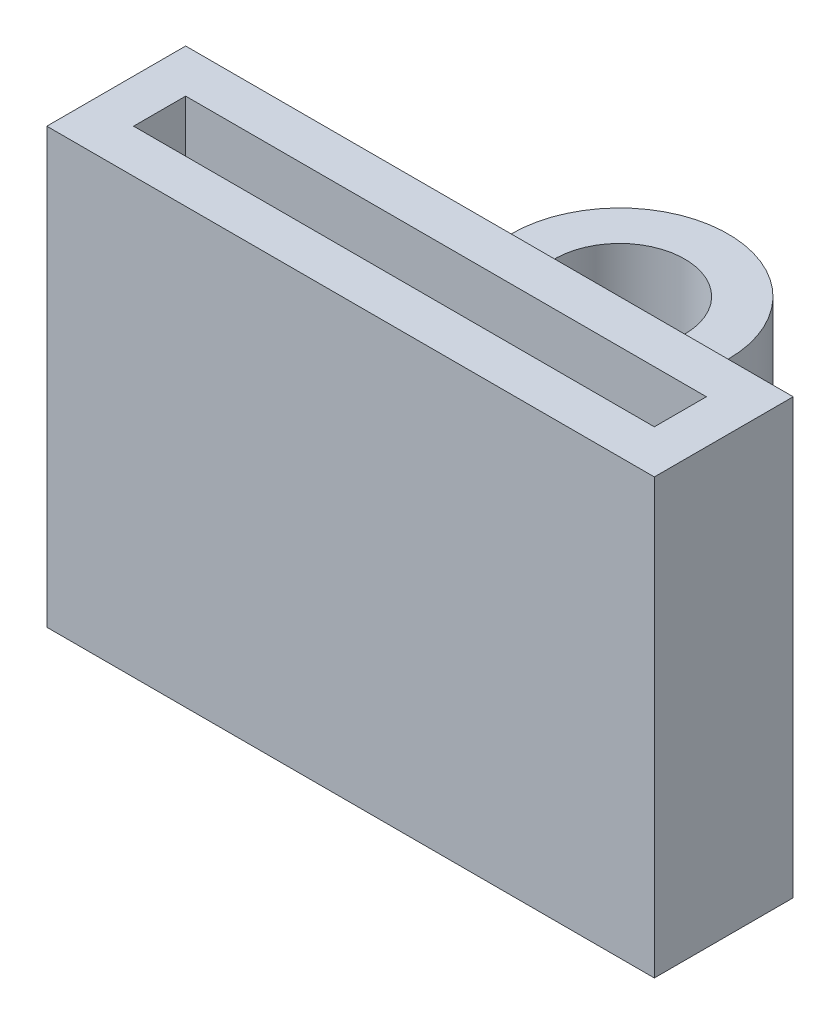
ISO-10303-21;
HEADER;
FILE_DESCRIPTION(('STEP AP214'),'2;1');
FILE_NAME('part.step','',(''),(''),'','','');
FILE_SCHEMA(('AUTOMOTIVE_DESIGN { 1 0 10303 214 1 1 1 1 }'));
ENDSEC;
DATA;
#1=APPLICATION_CONTEXT('core data for automotive mechanical design processes');
#2=APPLICATION_PROTOCOL_DEFINITION('international standard','automotive_design',2000,#1);
#3=PRODUCT_CONTEXT('',#1,'mechanical');
#4=PRODUCT('Part','Part','',(#3));
#5=PRODUCT_RELATED_PRODUCT_CATEGORY('part','',(#4));
#6=PRODUCT_DEFINITION_FORMATION('','',#4);
#7=PRODUCT_DEFINITION_CONTEXT('part definition',#1,'design');
#8=PRODUCT_DEFINITION('design','',#6,#7);
#9=PRODUCT_DEFINITION_SHAPE('','',#8);
#10=(LENGTH_UNIT() NAMED_UNIT(*) SI_UNIT(.MILLI.,.METRE.));
#11=(NAMED_UNIT(*) PLANE_ANGLE_UNIT() SI_UNIT($,.RADIAN.));
#12=(NAMED_UNIT(*) SI_UNIT($,.STERADIAN.) SOLID_ANGLE_UNIT());
#13=UNCERTAINTY_MEASURE_WITH_UNIT(LENGTH_MEASURE(1.E-05),#10,'distance_accuracy_value','');
#14=(GEOMETRIC_REPRESENTATION_CONTEXT(3) GLOBAL_UNCERTAINTY_ASSIGNED_CONTEXT((#13)) GLOBAL_UNIT_ASSIGNED_CONTEXT((#10,
#11,#12)) REPRESENTATION_CONTEXT('',''));
#15=CARTESIAN_POINT('',(0.,0.,0.));
#16=DIRECTION('',(0.,0.,1.));
#17=DIRECTION('',(1.,0.,0.));
#18=AXIS2_PLACEMENT_3D('',#15,#16,#17);
#19=CARTESIAN_POINT('',(0.,5.,-1.6));
#20=DIRECTION('',(0.,0.,-1.));
#21=DIRECTION('',(-1.,0.,0.));
#22=AXIS2_PLACEMENT_3D('',#19,#20,#21);
#23=PLANE('',#22);
#24=DIRECTION('',(1.,0.,0.));
#25=VECTOR('',#24,1.);
#26=CARTESIAN_POINT('',(0.,-5.,-1.6));
#27=LINE('',#26,#25);
#28=CARTESIAN_POINT('',(2.5,-5.,-1.6));
#29=VERTEX_POINT('',#28);
#30=CARTESIAN_POINT('',(6.99999999999999,-5.,-1.6));
#31=VERTEX_POINT('',#30);
#32=EDGE_CURVE('E55',#29,#31,#27,.T.);
#33=ORIENTED_EDGE('',*,*,#32,.F.);
#34=DIRECTION('',(0.,1.,0.));
#35=VECTOR('',#34,1.);
#36=CARTESIAN_POINT('',(2.5,-5.,-1.6));
#37=LINE('',#36,#35);
#38=CARTESIAN_POINT('',(2.5,2.,-1.6));
#39=VERTEX_POINT('',#38);
#40=EDGE_CURVE('E50',#29,#39,#37,.T.);
#41=ORIENTED_EDGE('',*,*,#40,.T.);
#42=DIRECTION('',(1.,0.,0.));
#43=VECTOR('',#42,1.);
#44=CARTESIAN_POINT('',(0.,2.,-1.6));
#45=LINE('',#44,#43);
#46=CARTESIAN_POINT('',(-2.5,2.,-1.6));
#47=VERTEX_POINT('',#46);
#48=EDGE_CURVE('E144',#47,#39,#45,.T.);
#49=ORIENTED_EDGE('',*,*,#48,.F.);
#50=DIRECTION('',(0.,1.,0.));
#51=VECTOR('',#50,1.);
#52=CARTESIAN_POINT('',(-2.5,-5.,-1.6));
#53=LINE('',#52,#51);
#54=CARTESIAN_POINT('',(-2.5,-5.,-1.6));
#55=VERTEX_POINT('',#54);
#56=EDGE_CURVE('E162',#55,#47,#53,.T.);
#57=ORIENTED_EDGE('',*,*,#56,.F.);
#58=CARTESIAN_POINT('',(-7.00000000000001,-5.,-1.6));
#59=VERTEX_POINT('',#58);
#60=EDGE_CURVE('E191',#59,#55,#27,.T.);
#61=ORIENTED_EDGE('',*,*,#60,.F.);
#62=DIRECTION('',(0.,-1.,0.));
#63=VECTOR('',#62,1.);
#64=CARTESIAN_POINT('',(-7.00000000000001,5.,-1.6));
#65=LINE('',#64,#63);
#66=CARTESIAN_POINT('',(-7.00000000000001,5.,-1.6));
#67=VERTEX_POINT('',#66);
#68=EDGE_CURVE('E218',#67,#59,#65,.T.);
#69=ORIENTED_EDGE('',*,*,#68,.F.);
#70=DIRECTION('',(1.,0.,0.));
#71=VECTOR('',#70,1.);
#72=CARTESIAN_POINT('',(0.,5.,-1.6));
#73=LINE('',#72,#71);
#74=CARTESIAN_POINT('',(6.99999999999999,5.,-1.6));
#75=VERTEX_POINT('',#74);
#76=EDGE_CURVE('E169',#67,#75,#73,.T.);
#77=ORIENTED_EDGE('',*,*,#76,.T.);
#78=DIRECTION('',(0.,-1.,0.));
#79=VECTOR('',#78,1.);
#80=CARTESIAN_POINT('',(6.99999999999999,5.,-1.6));
#81=LINE('',#80,#79);
#82=EDGE_CURVE('E37',#75,#31,#81,.T.);
#83=ORIENTED_EDGE('',*,*,#82,.T.);
#84=EDGE_LOOP('',(#33,#41,#49,#57,#61,#69,#77,#83));
#85=FACE_BOUND('',#84,.T.);
#86=ADVANCED_FACE('F33',(#85),#23,.T.);
#87=CARTESIAN_POINT('',(0.,5.,-0.600000000000001));
#88=DIRECTION('',(0.,0.,-1.));
#89=DIRECTION('',(-1.,0.,0.));
#90=AXIS2_PLACEMENT_3D('',#87,#88,#89);
#91=PLANE('',#90);
#92=DIRECTION('',(1.,0.,0.));
#93=VECTOR('',#92,1.);
#94=CARTESIAN_POINT('',(0.,-5.,-0.600000000000001));
#95=LINE('',#94,#93);
#96=CARTESIAN_POINT('',(-6.00000000000001,-5.,-0.600000000000001));
#97=VERTEX_POINT('',#96);
#98=CARTESIAN_POINT('',(5.99999999999999,-5.,-0.600000000000001));
#99=VERTEX_POINT('',#98);
#100=EDGE_CURVE('E199',#97,#99,#95,.T.);
#101=ORIENTED_EDGE('',*,*,#100,.T.);
#102=DIRECTION('',(0.,-1.,0.));
#103=VECTOR('',#102,1.);
#104=CARTESIAN_POINT('',(5.99999999999999,5.,-0.600000000000001));
#105=LINE('',#104,#103);
#106=CARTESIAN_POINT('',(5.99999999999999,5.,-0.600000000000001));
#107=VERTEX_POINT('',#106);
#108=EDGE_CURVE('E11',#107,#99,#105,.T.);
#109=ORIENTED_EDGE('',*,*,#108,.F.);
#110=DIRECTION('',(1.,0.,0.));
#111=VECTOR('',#110,1.);
#112=CARTESIAN_POINT('',(0.,5.,-0.600000000000001));
#113=LINE('',#112,#111);
#114=CARTESIAN_POINT('',(-6.00000000000001,5.,-0.600000000000001));
#115=VERTEX_POINT('',#114);
#116=EDGE_CURVE('E177',#115,#107,#113,.T.);
#117=ORIENTED_EDGE('',*,*,#116,.F.);
#118=DIRECTION('',(0.,-1.,0.));
#119=VECTOR('',#118,1.);
#120=CARTESIAN_POINT('',(-6.00000000000001,5.,-0.600000000000001));
#121=LINE('',#120,#119);
#122=EDGE_CURVE('E210',#115,#97,#121,.T.);
#123=ORIENTED_EDGE('',*,*,#122,.T.);
#124=EDGE_LOOP('',(#101,#109,#117,#123));
#125=FACE_BOUND('',#124,.T.);
#126=ADVANCED_FACE('F255',(#125),#91,.F.);
#127=CARTESIAN_POINT('',(5.99999999999999,5.,0.));
#128=DIRECTION('',(1.,0.,0.));
#129=DIRECTION('',(0.,0.,-1.));
#130=AXIS2_PLACEMENT_3D('',#127,#128,#129);
#131=PLANE('',#130);
#132=DIRECTION('',(0.,0.,1.));
#133=VECTOR('',#132,1.);
#134=CARTESIAN_POINT('',(5.99999999999999,-5.,0.));
#135=LINE('',#134,#133);
#136=CARTESIAN_POINT('',(5.99999999999999,-5.,0.599999999999999));
#137=VERTEX_POINT('',#136);
#138=EDGE_CURVE('E202',#99,#137,#135,.T.);
#139=ORIENTED_EDGE('',*,*,#138,.T.);
#140=DIRECTION('',(0.,-1.,0.));
#141=VECTOR('',#140,1.);
#142=CARTESIAN_POINT('',(5.99999999999999,5.,0.599999999999999));
#143=LINE('',#142,#141);
#144=CARTESIAN_POINT('',(5.99999999999999,5.,0.599999999999999));
#145=VERTEX_POINT('',#144);
#146=EDGE_CURVE('E42',#145,#137,#143,.T.);
#147=ORIENTED_EDGE('',*,*,#146,.F.);
#148=DIRECTION('',(0.,0.,1.));
#149=VECTOR('',#148,1.);
#150=CARTESIAN_POINT('',(5.99999999999999,5.,0.));
#151=LINE('',#150,#149);
#152=EDGE_CURVE('E180',#107,#145,#151,.T.);
#153=ORIENTED_EDGE('',*,*,#152,.F.);
#154=ORIENTED_EDGE('',*,*,#108,.T.);
#155=EDGE_LOOP('',(#139,#147,#153,#154));
#156=FACE_BOUND('',#155,.T.);
#157=ADVANCED_FACE('F259',(#156),#131,.F.);
#158=CARTESIAN_POINT('',(0.,5.,0.599999999999999));
#159=DIRECTION('',(0.,0.,-1.));
#160=DIRECTION('',(-1.,0.,0.));
#161=AXIS2_PLACEMENT_3D('',#158,#159,#160);
#162=PLANE('',#161);
#163=DIRECTION('',(1.,0.,0.));
#164=VECTOR('',#163,1.);
#165=CARTESIAN_POINT('',(0.,-5.,0.599999999999999));
#166=LINE('',#165,#164);
#167=CARTESIAN_POINT('',(-6.00000000000001,-5.,0.599999999999999));
#168=VERTEX_POINT('',#167);
#169=EDGE_CURVE('E205',#168,#137,#166,.T.);
#170=ORIENTED_EDGE('',*,*,#169,.F.);
#171=DIRECTION('',(0.,-1.,0.));
#172=VECTOR('',#171,1.);
#173=CARTESIAN_POINT('',(-6.00000000000001,5.,0.599999999999999));
#174=LINE('',#173,#172);
#175=CARTESIAN_POINT('',(-6.00000000000001,5.,0.599999999999999));
#176=VERTEX_POINT('',#175);
#177=EDGE_CURVE('E212',#176,#168,#174,.T.);
#178=ORIENTED_EDGE('',*,*,#177,.F.);
#179=DIRECTION('',(1.,0.,0.));
#180=VECTOR('',#179,1.);
#181=CARTESIAN_POINT('',(0.,5.,0.599999999999999));
#182=LINE('',#181,#180);
#183=EDGE_CURVE('E182',#176,#145,#182,.T.);
#184=ORIENTED_EDGE('',*,*,#183,.T.);
#185=ORIENTED_EDGE('',*,*,#146,.T.);
#186=EDGE_LOOP('',(#170,#178,#184,#185));
#187=FACE_BOUND('',#186,.T.);
#188=ADVANCED_FACE('F264',(#187),#162,.T.);
#189=CARTESIAN_POINT('',(6.99999999999999,5.,0.));
#190=DIRECTION('',(1.,0.,0.));
#191=DIRECTION('',(0.,0.,-1.));
#192=AXIS2_PLACEMENT_3D('',#189,#190,#191);
#193=PLANE('',#192);
#194=DIRECTION('',(0.,0.,1.));
#195=VECTOR('',#194,1.);
#196=CARTESIAN_POINT('',(6.99999999999999,-5.,0.));
#197=LINE('',#196,#195);
#198=CARTESIAN_POINT('',(6.99999999999999,-5.,1.6));
#199=VERTEX_POINT('',#198);
#200=EDGE_CURVE('E161',#31,#199,#197,.T.);
#201=ORIENTED_EDGE('',*,*,#200,.F.);
#202=ORIENTED_EDGE('',*,*,#82,.F.);
#203=DIRECTION('',(0.,0.,1.));
#204=VECTOR('',#203,1.);
#205=CARTESIAN_POINT('',(6.99999999999999,5.,0.));
#206=LINE('',#205,#204);
#207=CARTESIAN_POINT('',(6.99999999999999,5.,1.6));
#208=VERTEX_POINT('',#207);
#209=EDGE_CURVE('E166',#75,#208,#206,.T.);
#210=ORIENTED_EDGE('',*,*,#209,.T.);
#211=DIRECTION('',(0.,-1.,0.));
#212=VECTOR('',#211,1.);
#213=CARTESIAN_POINT('',(6.99999999999999,5.,1.6));
#214=LINE('',#213,#212);
#215=EDGE_CURVE('E188',#208,#199,#214,.T.);
#216=ORIENTED_EDGE('',*,*,#215,.T.);
#217=EDGE_LOOP('',(#201,#202,#210,#216));
#218=FACE_BOUND('',#217,.T.);
#219=ADVANCED_FACE('F35',(#218),#193,.T.);
#220=CARTESIAN_POINT('',(-7.00000000000001,5.,0.));
#221=DIRECTION('',(1.,0.,0.));
#222=DIRECTION('',(0.,0.,-1.));
#223=AXIS2_PLACEMENT_3D('',#220,#221,#222);
#224=PLANE('',#223);
#225=DIRECTION('',(0.,0.,1.));
#226=VECTOR('',#225,1.);
#227=CARTESIAN_POINT('',(-7.00000000000001,-5.,0.));
#228=LINE('',#227,#226);
#229=CARTESIAN_POINT('',(-7.00000000000001,-5.,1.6));
#230=VERTEX_POINT('',#229);
#231=EDGE_CURVE('E194',#59,#230,#228,.T.);
#232=ORIENTED_EDGE('',*,*,#231,.T.);
#233=DIRECTION('',(0.,-1.,0.));
#234=VECTOR('',#233,1.);
#235=CARTESIAN_POINT('',(-7.00000000000001,5.,1.6));
#236=LINE('',#235,#234);
#237=CARTESIAN_POINT('',(-7.00000000000001,5.,1.6));
#238=VERTEX_POINT('',#237);
#239=EDGE_CURVE('E216',#238,#230,#236,.T.);
#240=ORIENTED_EDGE('',*,*,#239,.F.);
#241=DIRECTION('',(0.,0.,1.));
#242=VECTOR('',#241,1.);
#243=CARTESIAN_POINT('',(-7.00000000000001,5.,0.));
#244=LINE('',#243,#242);
#245=EDGE_CURVE('E173',#67,#238,#244,.T.);
#246=ORIENTED_EDGE('',*,*,#245,.F.);
#247=ORIENTED_EDGE('',*,*,#68,.T.);
#248=EDGE_LOOP('',(#232,#240,#246,#247));
#249=FACE_BOUND('',#248,.T.);
#250=ADVANCED_FACE('F236',(#249),#224,.F.);
#251=CARTESIAN_POINT('',(0.,5.,1.6));
#252=DIRECTION('',(0.,0.,-1.));
#253=DIRECTION('',(-1.,0.,0.));
#254=AXIS2_PLACEMENT_3D('',#251,#252,#253);
#255=PLANE('',#254);
#256=DIRECTION('',(1.,0.,0.));
#257=VECTOR('',#256,1.);
#258=CARTESIAN_POINT('',(0.,-5.,1.6));
#259=LINE('',#258,#257);
#260=EDGE_CURVE('E196',#230,#199,#259,.T.);
#261=ORIENTED_EDGE('',*,*,#260,.T.);
#262=ORIENTED_EDGE('',*,*,#215,.F.);
#263=DIRECTION('',(1.,0.,0.));
#264=VECTOR('',#263,1.);
#265=CARTESIAN_POINT('',(0.,5.,1.6));
#266=LINE('',#265,#264);
#267=EDGE_CURVE('E175',#238,#208,#266,.T.);
#268=ORIENTED_EDGE('',*,*,#267,.F.);
#269=ORIENTED_EDGE('',*,*,#239,.T.);
#270=EDGE_LOOP('',(#261,#262,#268,#269));
#271=FACE_BOUND('',#270,.T.);
#272=ADVANCED_FACE('F242',(#271),#255,.F.);
#273=CARTESIAN_POINT('',(-6.00000000000001,5.,0.));
#274=DIRECTION('',(1.,0.,0.));
#275=DIRECTION('',(0.,0.,-1.));
#276=AXIS2_PLACEMENT_3D('',#273,#274,#275);
#277=PLANE('',#276);
#278=DIRECTION('',(0.,0.,1.));
#279=VECTOR('',#278,1.);
#280=CARTESIAN_POINT('',(-6.00000000000001,-5.,0.));
#281=LINE('',#280,#279);
#282=EDGE_CURVE('E170',#97,#168,#281,.T.);
#283=ORIENTED_EDGE('',*,*,#282,.F.);
#284=ORIENTED_EDGE('',*,*,#122,.F.);
#285=DIRECTION('',(0.,0.,1.));
#286=VECTOR('',#285,1.);
#287=CARTESIAN_POINT('',(-6.00000000000001,5.,0.));
#288=LINE('',#287,#286);
#289=EDGE_CURVE('E185',#115,#176,#288,.T.);
#290=ORIENTED_EDGE('',*,*,#289,.T.);
#291=ORIENTED_EDGE('',*,*,#177,.T.);
#292=EDGE_LOOP('',(#283,#284,#290,#291));
#293=FACE_BOUND('',#292,.T.);
#294=ADVANCED_FACE('F244',(#293),#277,.T.);
#295=CARTESIAN_POINT('',(0.,5.,0.));
#296=DIRECTION('',(0.,1.,0.));
#297=DIRECTION('',(0.,0.,1.));
#298=AXIS2_PLACEMENT_3D('',#295,#296,#297);
#299=PLANE('',#298);
#300=ORIENTED_EDGE('',*,*,#209,.F.);
#301=ORIENTED_EDGE('',*,*,#76,.F.);
#302=ORIENTED_EDGE('',*,*,#245,.T.);
#303=ORIENTED_EDGE('',*,*,#267,.T.);
#304=EDGE_LOOP('',(#300,#301,#302,#303));
#305=FACE_BOUND('',#304,.T.);
#306=ORIENTED_EDGE('',*,*,#116,.T.);
#307=ORIENTED_EDGE('',*,*,#152,.T.);
#308=ORIENTED_EDGE('',*,*,#183,.F.);
#309=ORIENTED_EDGE('',*,*,#289,.F.);
#310=EDGE_LOOP('',(#306,#307,#308,#309));
#311=FACE_BOUND('',#310,.T.);
#312=ADVANCED_FACE('F239',(#305,#311),#299,.T.);
#313=CARTESIAN_POINT('',(0.,-5.,0.));
#314=DIRECTION('',(0.,1.,0.));
#315=DIRECTION('',(0.,0.,1.));
#316=AXIS2_PLACEMENT_3D('',#313,#314,#315);
#317=PLANE('',#316);
#318=ORIENTED_EDGE('',*,*,#200,.T.);
#319=ORIENTED_EDGE('',*,*,#260,.F.);
#320=ORIENTED_EDGE('',*,*,#231,.F.);
#321=ORIENTED_EDGE('',*,*,#60,.T.);
#322=DIRECTION('',(0.,0.,1.));
#323=VECTOR('',#322,1.);
#324=CARTESIAN_POINT('',(-2.5,-5.,0.));
#325=LINE('',#324,#323);
#326=CARTESIAN_POINT('',(-2.5,-5.,-4.6));
#327=VERTEX_POINT('',#326);
#328=EDGE_CURVE('E133',#327,#55,#325,.T.);
#329=ORIENTED_EDGE('',*,*,#328,.F.);
#330=CARTESIAN_POINT('',(0.,-5.,-4.6));
#331=DIRECTION('',(0.,1.,0.));
#332=DIRECTION('',(0.,0.,1.));
#333=AXIS2_PLACEMENT_3D('',#330,#331,#332);
#334=CIRCLE('',#333,2.5);
#335=CARTESIAN_POINT('',(2.5,-5.,-4.6));
#336=VERTEX_POINT('',#335);
#337=EDGE_CURVE('E156',#336,#327,#334,.T.);
#338=ORIENTED_EDGE('',*,*,#337,.F.);
#339=DIRECTION('',(0.,0.,1.));
#340=VECTOR('',#339,1.);
#341=CARTESIAN_POINT('',(2.5,-5.,0.));
#342=LINE('',#341,#340);
#343=EDGE_CURVE('E128',#336,#29,#342,.T.);
#344=ORIENTED_EDGE('',*,*,#343,.T.);
#345=ORIENTED_EDGE('',*,*,#32,.T.);
#346=EDGE_LOOP('',(#318,#319,#320,#321,#329,#338,#344,#345));
#347=FACE_BOUND('',#346,.T.);
#348=ORIENTED_EDGE('',*,*,#100,.F.);
#349=ORIENTED_EDGE('',*,*,#282,.T.);
#350=ORIENTED_EDGE('',*,*,#169,.T.);
#351=ORIENTED_EDGE('',*,*,#138,.F.);
#352=EDGE_LOOP('',(#348,#349,#350,#351));
#353=FACE_BOUND('',#352,.T.);
#354=CARTESIAN_POINT('',(0.,-5.,-4.6));
#355=DIRECTION('',(0.,1.,0.));
#356=DIRECTION('',(0.,0.,1.));
#357=AXIS2_PLACEMENT_3D('',#354,#355,#356);
#358=CIRCLE('',#357,1.5);
#359=CARTESIAN_POINT('',(0.,-5.,-3.1));
#360=VERTEX_POINT('',#359);
#361=EDGE_CURVE('E152',#360,#360,#358,.T.);
#362=ORIENTED_EDGE('',*,*,#361,.T.);
#363=EDGE_LOOP('',(#362));
#364=FACE_BOUND('',#363,.T.);
#365=ADVANCED_FACE('F229',(#347,#353,#364),#317,.F.);
#366=CARTESIAN_POINT('',(2.5,-5.,0.));
#367=DIRECTION('',(-1.,0.,0.));
#368=DIRECTION('',(0.,0.,1.));
#369=AXIS2_PLACEMENT_3D('',#366,#367,#368);
#370=PLANE('',#369);
#371=DIRECTION('',(0.,1.,0.));
#372=VECTOR('',#371,1.);
#373=CARTESIAN_POINT('',(2.5,-5.,-4.6));
#374=LINE('',#373,#372);
#375=CARTESIAN_POINT('',(2.5,2.,-4.6));
#376=VERTEX_POINT('',#375);
#377=EDGE_CURVE('E123',#336,#376,#374,.T.);
#378=ORIENTED_EDGE('',*,*,#377,.T.);
#379=DIRECTION('',(0.,0.,1.));
#380=VECTOR('',#379,1.);
#381=CARTESIAN_POINT('',(2.5,2.,0.));
#382=LINE('',#381,#380);
#383=EDGE_CURVE('E127',#376,#39,#382,.T.);
#384=ORIENTED_EDGE('',*,*,#383,.T.);
#385=ORIENTED_EDGE('',*,*,#40,.F.);
#386=ORIENTED_EDGE('',*,*,#343,.F.);
#387=EDGE_LOOP('',(#378,#384,#385,#386));
#388=FACE_BOUND('',#387,.T.);
#389=ADVANCED_FACE('F125',(#388),#370,.F.);
#390=CARTESIAN_POINT('',(-2.5,-5.,0.));
#391=DIRECTION('',(-1.,0.,0.));
#392=DIRECTION('',(0.,0.,1.));
#393=AXIS2_PLACEMENT_3D('',#390,#391,#392);
#394=PLANE('',#393);
#395=ORIENTED_EDGE('',*,*,#56,.T.);
#396=DIRECTION('',(0.,0.,1.));
#397=VECTOR('',#396,1.);
#398=CARTESIAN_POINT('',(-2.5,2.,0.));
#399=LINE('',#398,#397);
#400=CARTESIAN_POINT('',(-2.5,2.,-4.6));
#401=VERTEX_POINT('',#400);
#402=EDGE_CURVE('E141',#401,#47,#399,.T.);
#403=ORIENTED_EDGE('',*,*,#402,.F.);
#404=DIRECTION('',(0.,1.,0.));
#405=VECTOR('',#404,1.);
#406=CARTESIAN_POINT('',(-2.5,-5.,-4.6));
#407=LINE('',#406,#405);
#408=EDGE_CURVE('E132',#327,#401,#407,.T.);
#409=ORIENTED_EDGE('',*,*,#408,.F.);
#410=ORIENTED_EDGE('',*,*,#328,.T.);
#411=EDGE_LOOP('',(#395,#403,#409,#410));
#412=FACE_BOUND('',#411,.T.);
#413=ADVANCED_FACE('F234',(#412),#394,.T.);
#414=CARTESIAN_POINT('',(0.,-5.,-4.6));
#415=DIRECTION('',(0.,1.,0.));
#416=DIRECTION('',(0.,0.,1.));
#417=AXIS2_PLACEMENT_3D('',#414,#415,#416);
#418=CYLINDRICAL_SURFACE('',#417,1.5);
#419=ORIENTED_EDGE('',*,*,#361,.F.);
#420=EDGE_LOOP('',(#419));
#421=FACE_BOUND('',#420,.T.);
#422=CARTESIAN_POINT('',(0.,2.,-4.6));
#423=DIRECTION('',(0.,1.,0.));
#424=DIRECTION('',(0.,0.,1.));
#425=AXIS2_PLACEMENT_3D('',#422,#423,#424);
#426=CIRCLE('',#425,1.5);
#427=CARTESIAN_POINT('',(0.,2.,-3.1));
#428=VERTEX_POINT('',#427);
#429=EDGE_CURVE('E145',#428,#428,#426,.T.);
#430=ORIENTED_EDGE('',*,*,#429,.T.);
#431=EDGE_LOOP('',(#430));
#432=FACE_BOUND('',#431,.T.);
#433=ADVANCED_FACE('F275',(#421,#432),#418,.F.);
#434=CARTESIAN_POINT('',(0.,-5.,-4.6));
#435=DIRECTION('',(0.,1.,0.));
#436=DIRECTION('',(0.,0.,1.));
#437=AXIS2_PLACEMENT_3D('',#434,#435,#436);
#438=CYLINDRICAL_SURFACE('',#437,2.5);
#439=ORIENTED_EDGE('',*,*,#408,.T.);
#440=CARTESIAN_POINT('',(0.,2.,-4.6));
#441=DIRECTION('',(0.,1.,0.));
#442=DIRECTION('',(0.,0.,1.));
#443=AXIS2_PLACEMENT_3D('',#440,#441,#442);
#444=CIRCLE('',#443,2.5);
#445=EDGE_CURVE('E136',#376,#401,#444,.T.);
#446=ORIENTED_EDGE('',*,*,#445,.F.);
#447=ORIENTED_EDGE('',*,*,#377,.F.);
#448=ORIENTED_EDGE('',*,*,#337,.T.);
#449=EDGE_LOOP('',(#439,#446,#447,#448));
#450=FACE_BOUND('',#449,.T.);
#451=ADVANCED_FACE('F137',(#450),#438,.T.);
#452=CARTESIAN_POINT('',(0.,2.,0.));
#453=DIRECTION('',(0.,1.,0.));
#454=DIRECTION('',(0.,0.,1.));
#455=AXIS2_PLACEMENT_3D('',#452,#453,#454);
#456=PLANE('',#455);
#457=ORIENTED_EDGE('',*,*,#429,.F.);
#458=EDGE_LOOP('',(#457));
#459=FACE_BOUND('',#458,.T.);
#460=ORIENTED_EDGE('',*,*,#383,.F.);
#461=ORIENTED_EDGE('',*,*,#445,.T.);
#462=ORIENTED_EDGE('',*,*,#402,.T.);
#463=ORIENTED_EDGE('',*,*,#48,.T.);
#464=EDGE_LOOP('',(#460,#461,#462,#463));
#465=FACE_BOUND('',#464,.T.);
#466=ADVANCED_FACE('F143',(#459,#465),#456,.T.);
#467=CLOSED_SHELL('',(#86,#126,#157,#188,#219,#250,#272,#294,#312,#365,#389,#413,#433,#451,#466));
#468=MANIFOLD_SOLID_BREP('B2',#467);
#469=ADVANCED_BREP_SHAPE_REPRESENTATION('',(#18,#468),#14);
#470=SHAPE_DEFINITION_REPRESENTATION(#9,#469);
ENDSEC;
END-ISO-10303-21;
